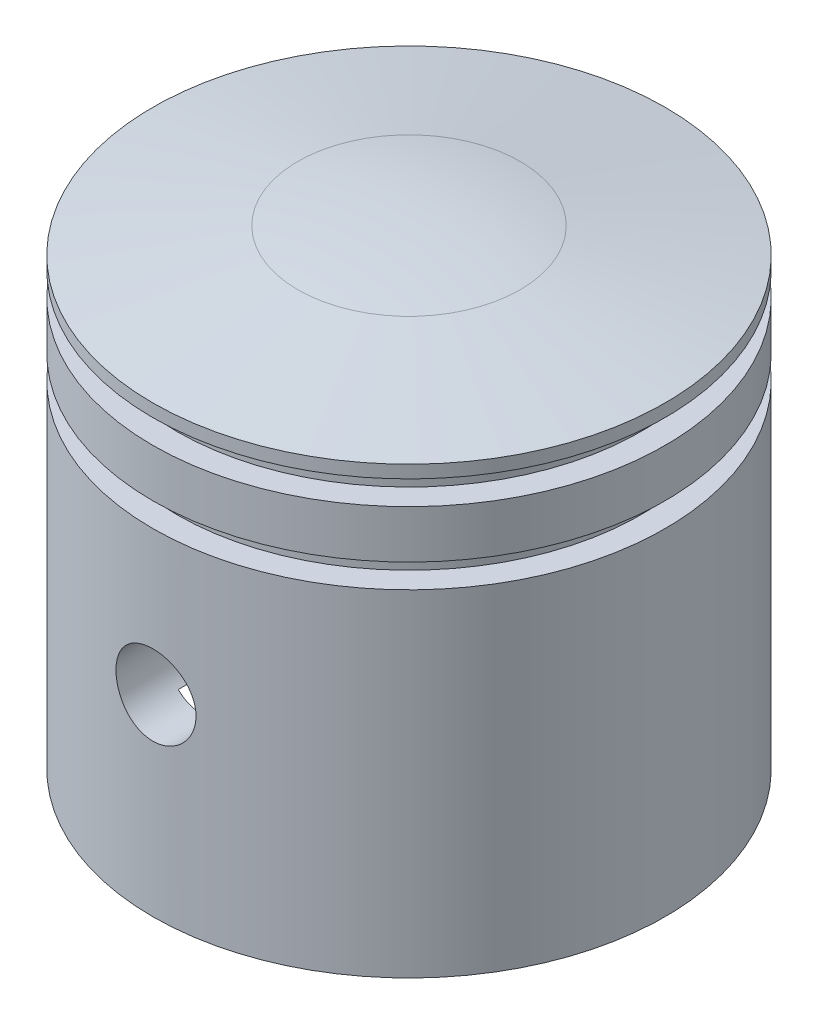
ISO-10303-21;
HEADER;
FILE_DESCRIPTION(('STEP AP214'),'2;1');
FILE_NAME('part.step','',(''),(''),'','','');
FILE_SCHEMA(('AUTOMOTIVE_DESIGN { 1 0 10303 214 1 1 1 1 }'));
ENDSEC;
DATA;
#1=APPLICATION_CONTEXT('core data for automotive mechanical design processes');
#2=APPLICATION_PROTOCOL_DEFINITION('international standard','automotive_design',2000,#1);
#3=PRODUCT_CONTEXT('',#1,'mechanical');
#4=PRODUCT('Part','Part','',(#3));
#5=PRODUCT_RELATED_PRODUCT_CATEGORY('part','',(#4));
#6=PRODUCT_DEFINITION_FORMATION('','',#4);
#7=PRODUCT_DEFINITION_CONTEXT('part definition',#1,'design');
#8=PRODUCT_DEFINITION('design','',#6,#7);
#9=PRODUCT_DEFINITION_SHAPE('','',#8);
#10=(LENGTH_UNIT() NAMED_UNIT(*) SI_UNIT(.MILLI.,.METRE.));
#11=(NAMED_UNIT(*) PLANE_ANGLE_UNIT() SI_UNIT($,.RADIAN.));
#12=(NAMED_UNIT(*) SI_UNIT($,.STERADIAN.) SOLID_ANGLE_UNIT());
#13=UNCERTAINTY_MEASURE_WITH_UNIT(LENGTH_MEASURE(1.E-05),#10,'distance_accuracy_value','');
#14=(GEOMETRIC_REPRESENTATION_CONTEXT(3) GLOBAL_UNCERTAINTY_ASSIGNED_CONTEXT((#13)) GLOBAL_UNIT_ASSIGNED_CONTEXT((#10,
#11,#12)) REPRESENTATION_CONTEXT('',''));
#15=CARTESIAN_POINT('',(0.,0.,0.));
#16=DIRECTION('',(0.,0.,1.));
#17=DIRECTION('',(1.,0.,0.));
#18=AXIS2_PLACEMENT_3D('',#15,#16,#17);
#19=CARTESIAN_POINT('',(0.,12.,-16.));
#20=DIRECTION('',(0.,0.,1.));
#21=DIRECTION('',(1.,0.,0.));
#22=AXIS2_PLACEMENT_3D('',#19,#20,#21);
#23=CYLINDRICAL_SURFACE('',#22,2.5);
#24=CARTESIAN_POINT('',(0.,14.5,-16.));
#25=CARTESIAN_POINT('',(-0.139515097271033,14.4999943017285,-15.9999977019448));
#26=CARTESIAN_POINT('',(-0.279109404865704,14.4882818862264,-15.9981561248574));
#27=CARTESIAN_POINT('',(-0.554391314978102,14.4417563087232,-15.9909869809759));
#28=CARTESIAN_POINT('',(-0.690075061323317,14.4069211074965,-15.9856560884472));
#29=CARTESIAN_POINT('',(-0.953512538047404,14.3152203371934,-15.9721069716578));
#30=CARTESIAN_POINT('',(-1.0812723522899,14.2583719186384,-15.9638909956317));
#31=CARTESIAN_POINT('',(-1.3254212510446,14.1243014548584,-15.9454779403815));
#32=CARTESIAN_POINT('',(-1.44181181036831,14.0470820569641,-15.9352811186255));
#33=CARTESIAN_POINT('',(-1.66091991165162,13.873766951646,-15.9139426841436));
#34=CARTESIAN_POINT('',(-1.76352747914264,13.7775330051098,-15.9027945139234));
#35=CARTESIAN_POINT('',(-1.95120768822823,13.5692180517311,-15.8808607613029));
#36=CARTESIAN_POINT('',(-2.03627928654192,13.4571361026998,-15.8700752005075));
#37=CARTESIAN_POINT('',(-2.18690544328884,13.2195617286563,-15.8500242812744));
#38=CARTESIAN_POINT('',(-2.25235273557992,13.0940005176382,-15.840767397861));
#39=CARTESIAN_POINT('',(-2.36118681597065,12.8334985891422,-15.8249120174236));
#40=CARTESIAN_POINT('',(-2.40457491010063,12.6985584274894,-15.8183133630222));
#41=CARTESIAN_POINT('',(-2.46771559322167,12.4242890988562,-15.8085863451104));
#42=CARTESIAN_POINT('',(-2.48765705487496,12.2850044141812,-15.8054302653236));
#43=CARTESIAN_POINT('',(-2.50392369757622,12.0050328111074,-15.8028617107177));
#44=CARTESIAN_POINT('',(-2.50025034860466,11.864345980534,-15.8034490028802));
#45=CARTESIAN_POINT('',(-2.4695458080889,11.5869029681473,-15.8082755045521));
#46=CARTESIAN_POINT('',(-2.44272562959693,11.4501227766469,-15.8124817218495));
#47=CARTESIAN_POINT('',(-2.36681937833752,11.1830279936407,-15.8240205634547));
#48=CARTESIAN_POINT('',(-2.31773262684132,11.0527135993595,-15.8313532830641));
#49=CARTESIAN_POINT('',(-2.19846916949384,10.8016112873228,-15.8483550685462));
#50=CARTESIAN_POINT('',(-2.12820372315549,10.6808662082269,-15.8580339308724));
#51=CARTESIAN_POINT('',(-1.96864058146637,10.4528004643145,-15.878630461501));
#52=CARTESIAN_POINT('',(-1.87934153253017,10.3454807551125,-15.8895482178821));
#53=CARTESIAN_POINT('',(-1.68309088822333,10.1460897533667,-15.911537862489));
#54=CARTESIAN_POINT('',(-1.57595800560539,10.0541968417305,-15.9226101363559));
#55=CARTESIAN_POINT('',(-1.34769694737936,9.8896668543601,-15.9435512534783));
#56=CARTESIAN_POINT('',(-1.22656870068132,9.81702987644317,-15.9534200906202));
#57=CARTESIAN_POINT('',(-0.973595927056491,9.69306192657761,-15.9708539902704));
#58=CARTESIAN_POINT('',(-0.841744186240459,9.641745441467,-15.9784174854193));
#59=CARTESIAN_POINT('',(-0.571149534696758,9.56203403255277,-15.9903756000068));
#60=CARTESIAN_POINT('',(-0.4324071306872,9.53363742593352,-15.9947704520898));
#61=CARTESIAN_POINT('',(-0.153508336763735,9.50081072354981,-15.9998651172728));
#62=CARTESIAN_POINT('',(-0.0133814615087024,9.49613552102382,-16.0006027179286));
#63=CARTESIAN_POINT('',(0.265654546411641,9.51023270533598,-15.9984028649127));
#64=CARTESIAN_POINT('',(0.404563719925156,9.52900430258911,-15.9954655349964));
#65=CARTESIAN_POINT('',(0.676473446265705,9.58925838768018,-15.9862692369322));
#66=CARTESIAN_POINT('',(0.809501262056041,9.63062075826773,-15.9800278421539));
#67=CARTESIAN_POINT('',(1.06673406785663,9.73475509439879,-15.9649207568356));
#68=CARTESIAN_POINT('',(1.19093861303941,9.79752813844267,-15.9560549341007));
#69=CARTESIAN_POINT('',(1.42807220225041,9.94327199112658,-15.9365897274094));
#70=CARTESIAN_POINT('',(1.54090512378372,10.0263974200905,-15.9259772866342));
#71=CARTESIAN_POINT('',(1.75110696507806,10.2102720859078,-15.9042388046444));
#72=CARTESIAN_POINT('',(1.84847490447018,10.3110224392049,-15.8931127309268));
#73=CARTESIAN_POINT('',(2.02588080776691,10.5283811972172,-15.8714802753665));
#74=CARTESIAN_POINT('',(2.10575398584126,10.6451248471223,-15.860980411908));
#75=CARTESIAN_POINT('',(2.2447556772664,10.8905160736613,-15.8419069280583));
#76=CARTESIAN_POINT('',(2.30388478778105,11.0191633074895,-15.83333325222));
#77=CARTESIAN_POINT('',(2.39946771944995,11.2842296407142,-15.8191307135236));
#78=CARTESIAN_POINT('',(2.43600654947912,11.4206174687656,-15.8134908234896));
#79=CARTESIAN_POINT('',(2.48564122040535,11.697689143664,-15.8057657028079));
#80=CARTESIAN_POINT('',(2.49873883084997,11.838372665419,-15.8036802038444));
#81=CARTESIAN_POINT('',(2.50107452690756,12.1183987159075,-15.8033105804488));
#82=CARTESIAN_POINT('',(2.49057180548425,12.2577390969335,-15.804985160429));
#83=CARTESIAN_POINT('',(2.44656223255901,12.5326452971443,-15.8118569894183));
#84=CARTESIAN_POINT('',(2.41305543086961,12.6682111245017,-15.8170542307995));
#85=CARTESIAN_POINT('',(2.32408329891852,12.9316378266405,-15.8303708885491));
#86=CARTESIAN_POINT('',(2.26863761738581,13.0595054782584,-15.8384876895341));
#87=CARTESIAN_POINT('',(2.13738768546417,13.3041656136763,-15.856731840474));
#88=CARTESIAN_POINT('',(2.06158262820886,13.4209576582884,-15.8668592701083));
#89=CARTESIAN_POINT('',(1.8908300813908,13.6414655441268,-15.8881156809226));
#90=CARTESIAN_POINT('',(1.79569107094768,13.7450321966138,-15.8992540116029));
#91=CARTESIAN_POINT('',(1.58937594638204,13.9348212363867,-15.9212004364073));
#92=CARTESIAN_POINT('',(1.47819612078432,14.0210395985919,-15.9320084534012));
#93=CARTESIAN_POINT('',(1.24216685884341,14.1741512230316,-15.952151024567));
#94=CARTESIAN_POINT('',(1.11723937214238,14.2409253727596,-15.9614763443027));
#95=CARTESIAN_POINT('',(0.857851882357782,14.3524409961929,-15.9775125983888));
#96=CARTESIAN_POINT('',(0.72340177658176,14.3972049725584,-15.9842262014212));
#97=CARTESIAN_POINT('',(0.490314239911593,14.4534330210906,-15.9927744586488));
#98=CARTESIAN_POINT('',(0.393105575651623,14.470868490629,-15.9954699162612));
#99=CARTESIAN_POINT('',(0.197277797850581,14.4941539133791,-15.9990834869762));
#100=CARTESIAN_POINT('',(0.0986587041691182,14.5000040295573,-16.0000016250796));
#101=CARTESIAN_POINT('',(0.,14.5,-16.));
#102=B_SPLINE_CURVE_WITH_KNOTS('',3,(#24,#25,#26,#27,#28,#29,#30,#31,#32,#33,#34,#35,#36,#37,
#38,#39,#40,#41,#42,#43,#44,#45,#46,#47,#48,#49,#50,#51,#52,#53,#54,#55,#56,#57,#58,#59,#60,#61,
#62,#63,#64,#65,#66,#67,#68,#69,#70,#71,#72,#73,#74,#75,#76,#77,#78,#79,#80,#81,#82,#83,#84,#85,
#86,#87,#88,#89,#90,#91,#92,#93,#94,#95,#96,#97,#98,#99,#100,#101),.UNSPECIFIED.,.T.,.F.,(4,2,2,
2,2,2,2,2,2,2,2,2,2,2,2,2,2,2,2,2,2,2,2,2,2,2,2,2,2,2,2,2,2,2,2,2,2,2,4),(0.,0.418184740477491,
0.836768642528014,1.25502707944103,1.6732311879203,2.09459568152199,2.51598523645422,
2.93963778605759,3.36326525009238,3.78345631134994,4.20362121670545,4.6199957602258,
5.0363829965105,5.45453977402347,5.87272629892068,6.29545732334367,6.71819049513827,
7.14121043754565,7.56419931829866,7.98280854005914,8.40140366528356,8.81779444756567,
9.23420620742031,9.65388541469671,10.0735912160142,10.4970948024959,10.9205861964898,
11.3424741039513,11.764330162293,12.1815758159869,12.598820566189,13.0156924696662,
13.4325808967135,13.8538201231554,14.275156971423,14.6990230419984,15.1224548565628,
15.4181801635154,15.7139013105871),.UNSPECIFIED.);
#103=CARTESIAN_POINT('',(0.,14.5,-16.));
#104=VERTEX_POINT('',#103);
#105=EDGE_CURVE('E150',#104,#104,#102,.T.);
#106=ORIENTED_EDGE('',*,*,#105,.F.);
#107=EDGE_LOOP('',(#106));
#108=FACE_BOUND('',#107,.T.);
#109=DIRECTION('',(0.,0.,1.));
#110=VECTOR('',#109,1.);
#111=CARTESIAN_POINT('',(1.5,10.,-16.));
#112=LINE('',#111,#110);
#113=CARTESIAN_POINT('',(1.5,10.,-9.88685996664259));
#114=VERTEX_POINT('',#113);
#115=CARTESIAN_POINT('',(1.5,10.,-12.913171570145));
#116=VERTEX_POINT('',#115);
#117=EDGE_CURVE('E86',#114,#116,#112,.F.);
#118=ORIENTED_EDGE('',*,*,#117,.F.);
#119=CARTESIAN_POINT('',(2.5,12.,-9.68245836551854));
#120=CARTESIAN_POINT('',(2.49999607859307,12.1380507509266,-9.6824610008786));
#121=CARTESIAN_POINT('',(2.48852624549765,12.2761448986785,-9.68544306014597));
#122=CARTESIAN_POINT('',(2.44302312546379,12.5483675781735,-9.69701861992564));
#123=CARTESIAN_POINT('',(2.40897670674211,12.6824937544682,-9.7056153862163));
#124=CARTESIAN_POINT('',(2.31949119963204,12.9428035381872,-9.7273872459615));
#125=CARTESIAN_POINT('',(2.26407972785449,13.0689971553857,-9.74055642690458));
#126=CARTESIAN_POINT('',(2.13352114126138,13.3103108525399,-9.76998192028759));
#127=CARTESIAN_POINT('',(2.05837318856069,13.4254304620802,-9.78623836378489));
#128=CARTESIAN_POINT('',(1.88870842731188,13.6438616452622,-9.82040716355625));
#129=CARTESIAN_POINT('',(1.79383688770405,13.74689360035,-9.83834597623034));
#130=CARTESIAN_POINT('',(1.58818206410066,13.9357613943603,-9.87362875515294));
#131=CARTESIAN_POINT('',(1.47739729418031,14.0215956256217,-9.89097266566388));
#132=CARTESIAN_POINT('',(1.24114520107896,14.1747754676313,-9.92340415520582));
#133=CARTESIAN_POINT('',(1.11549457619512,14.2418463881615,-9.93845687400592));
#134=CARTESIAN_POINT('',(0.854263184292763,14.3538096441531,-9.96430811925984));
#135=CARTESIAN_POINT('',(0.718683885791941,14.3987052519155,-9.97510727334345));
#136=CARTESIAN_POINT('',(0.444358758754162,14.4641478345786,-9.9910475884818));
#137=CARTESIAN_POINT('',(0.305732719548976,14.4851696443266,-9.99629893844314));
#138=CARTESIAN_POINT('',(0.0268288192627702,14.5037583792756,-10.000935941073));
#139=CARTESIAN_POINT('',(-0.113448794538067,14.5013287722096,-10.000322460967));
#140=CARTESIAN_POINT('',(-0.388380617930967,14.4734251497499,-9.99338094953534));
#141=CARTESIAN_POINT('',(-0.523090539002667,14.4484636749461,-9.98718002340871));
#142=CARTESIAN_POINT('',(-0.786345618534215,14.3770287299515,-9.96990836524857));
#143=CARTESIAN_POINT('',(-0.914890448426094,14.3305541146226,-9.95883737398452));
#144=CARTESIAN_POINT('',(-1.16351675875452,14.2169974293129,-9.93287509700884));
#145=CARTESIAN_POINT('',(-1.28351127441626,14.1497329553383,-9.91795019695011));
#146=CARTESIAN_POINT('',(-1.51068905585122,13.9966443208837,-9.88589903809692));
#147=CARTESIAN_POINT('',(-1.61787008771377,13.9108169314394,-9.8687723965265));
#148=CARTESIAN_POINT('',(-1.81943508771239,13.7202912580176,-9.83363713769356));
#149=CARTESIAN_POINT('',(-1.91339419768799,13.6151451076523,-9.81561719525297));
#150=CARTESIAN_POINT('',(-2.08244093990755,13.3904000264597,-9.78115043517327));
#151=CARTESIAN_POINT('',(-2.15752769011507,13.2708004205089,-9.76470369108289));
#152=CARTESIAN_POINT('',(-2.28697032255647,13.0197099658511,-9.73520496829319));
#153=CARTESIAN_POINT('',(-2.34122391742613,12.8881642696872,-9.72216983717007));
#154=CARTESIAN_POINT('',(-2.42671405159096,12.6174145319232,-9.70118640148669));
#155=CARTESIAN_POINT('',(-2.45795551638266,12.4782121360154,-9.69323700842733));
#156=CARTESIAN_POINT('',(-2.49582963866592,12.2000404984701,-9.68355356007457));
#157=CARTESIAN_POINT('',(-2.50309047391912,12.061162206659,-9.68166088976933));
#158=CARTESIAN_POINT('',(-2.49451699051516,11.7841780634147,-9.68387343364692));
#159=CARTESIAN_POINT('',(-2.4786847978498,11.6460721420506,-9.687978095703));
#160=CARTESIAN_POINT('',(-2.42492546393825,11.3768857350514,-9.70157081984979));
#161=CARTESIAN_POINT('',(-2.3873640682819,11.2457272734308,-9.71096970242532));
#162=CARTESIAN_POINT('',(-2.29161808167046,10.9915685421467,-9.73400718262805));
#163=CARTESIAN_POINT('',(-2.2334310477125,10.8685692409442,-9.74764628246408));
#164=CARTESIAN_POINT('',(-2.0967706679366,10.6315587221331,-9.77796137095511));
#165=CARTESIAN_POINT('',(-2.01792175383564,10.517771159957,-9.79469168607245));
#166=CARTESIAN_POINT('',(-1.84265073233613,10.3048116371985,-9.82917083071112));
#167=CARTESIAN_POINT('',(-1.7462257370136,10.2056420833499,-9.84691982728307));
#168=CARTESIAN_POINT('',(-1.53565680246182,10.0221889574291,-9.88197403031774));
#169=CARTESIAN_POINT('',(-1.42112988132898,9.9383399374512,-9.8992570206188));
#170=CARTESIAN_POINT('',(-1.17925670673669,9.79106413304875,-9.93097216613689));
#171=CARTESIAN_POINT('',(-1.05191112239398,9.72763628339179,-9.94540447003949));
#172=CARTESIAN_POINT('',(-0.788895504327727,9.62355396547207,-9.96970115738325));
#173=CARTESIAN_POINT('',(-0.653293452569706,9.58273571562093,-9.97959830022409));
#174=CARTESIAN_POINT('',(-0.376874400797019,9.52453966539158,-9.99385293395789));
#175=CARTESIAN_POINT('',(-0.236058412603103,9.50715734126096,-9.99821149393422));
#176=CARTESIAN_POINT('',(0.0427088161083069,9.49658102606115,-10.0008542352202));
#177=CARTESIAN_POINT('',(0.180634567415054,9.50274572726148,-9.99929947199971));
#178=CARTESIAN_POINT('',(0.453418741036876,9.53761956823587,-9.99064741143608));
#179=CARTESIAN_POINT('',(0.588277254452321,9.56632803753292,-9.98355027892922));
#180=CARTESIAN_POINT('',(0.850427589111934,9.64513054942715,-9.96463582134723));
#181=CARTESIAN_POINT('',(0.977756236452156,9.69510863328595,-9.95284411255981));
#182=CARTESIAN_POINT('',(1.22229263260406,9.81492644754893,-9.92578222284145));
#183=CARTESIAN_POINT('',(1.33949910316408,9.88476868167621,-9.91051160346894));
#184=CARTESIAN_POINT('',(1.56350482105826,10.0442880849903,-9.87768124200718));
#185=CARTESIAN_POINT('',(1.66998747074584,10.1344003572596,-9.86007542354161));
#186=CARTESIAN_POINT('',(1.86653755068376,10.3310571299434,-9.82476622642974));
#187=CARTESIAN_POINT('',(1.95660081269148,10.4376057902779,-9.80706282418256));
#188=CARTESIAN_POINT('',(2.11940506617958,10.6665035354736,-9.77318689613756));
#189=CARTESIAN_POINT('',(2.19179154854095,10.7891103084131,-9.75704909183222));
#190=CARTESIAN_POINT('',(2.31481724146367,11.045138724687,-9.7285988873707));
#191=CARTESIAN_POINT('',(2.36547227438038,11.1785524152346,-9.71628370583034));
#192=CARTESIAN_POINT('',(2.43605632142751,11.4264425295879,-9.69879771876843));
#193=CARTESIAN_POINT('',(2.4599829264922,11.5397329109653,-9.69271657508747));
#194=CARTESIAN_POINT('',(2.49195573142942,11.7686721724942,-9.6845459645655));
#195=CARTESIAN_POINT('',(2.50000328592938,11.884320850611,-9.68245615722769));
#196=CARTESIAN_POINT('',(2.5,12.,-9.68245836551854));
#197=B_SPLINE_CURVE_WITH_KNOTS('',3,(#119,#120,#121,#122,#123,#124,#125,#126,#127,#128,#129,
#130,#131,#132,#133,#134,#135,#136,#137,#138,#139,#140,#141,#142,#143,#144,#145,#146,#147,#148,
#149,#150,#151,#152,#153,#154,#155,#156,#157,#158,#159,#160,#161,#162,#163,#164,#165,#166,#167,
#168,#169,#170,#171,#172,#173,#174,#175,#176,#177,#178,#179,#180,#181,#182,#183,#184,#185,#186,
#187,#188,#189,#190,#191,#192,#193,#194,#195,#196),.UNSPECIFIED.,.T.,.F.,(4,2,2,2,2,2,2,2,2,2,2,
2,2,2,2,2,2,2,2,2,2,2,2,2,2,2,2,2,2,2,2,2,2,2,2,2,2,2,4),(0.,0.413727441736135,
0.827695741428666,1.24113072716602,1.65458326755479,2.07623954192976,2.49793521479867,
2.9255149639792,3.35303159847092,3.77188750995347,4.1906814866602,4.60018262688947,
5.00970556724786,5.42292874254445,5.83622385468913,6.26070466571912,6.68520531199802,
7.11176432008403,7.53823200129548,7.95343574764205,8.36860127188747,8.77697405014152,
9.18539521426363,9.60182845864103,10.0183301888999,10.4452533097026,10.872154157245,
11.2959207281187,11.7196054891398,12.131834461324,12.5440511738193,12.9540487656466,
13.3640980574302,13.7839709658702,14.2039503157045,14.6317647729113,15.0592672137502,
15.4059782718573,15.7526597510792),.UNSPECIFIED.);
#198=CARTESIAN_POINT('',(-1.5,10.,-9.88685996664259));
#199=VERTEX_POINT('',#198);
#200=EDGE_CURVE('E145',#114,#199,#197,.T.);
#201=ORIENTED_EDGE('',*,*,#200,.T.);
#202=DIRECTION('',(0.,0.,1.));
#203=VECTOR('',#202,1.);
#204=CARTESIAN_POINT('',(-1.5,10.,-16.));
#205=LINE('',#204,#203);
#206=CARTESIAN_POINT('',(-1.5,10.,-12.913171570145));
#207=VERTEX_POINT('',#206);
#208=EDGE_CURVE('E105',#207,#199,#205,.T.);
#209=ORIENTED_EDGE('',*,*,#208,.F.);
#210=CARTESIAN_POINT('',(-1.5,10.,-12.913171570145));
#211=CARTESIAN_POINT('',(-1.44426579878659,9.95820085358915,-12.9196464939997));
#212=CARTESIAN_POINT('',(-1.38679796540747,9.91874092086907,-12.9259549192278));
#213=CARTESIAN_POINT('',(-1.26873073828123,9.84473133764257,-12.9380773902685));
#214=CARTESIAN_POINT('',(-1.20813121991303,9.81018188274731,-12.9438914163828));
#215=CARTESIAN_POINT('',(-1.02224257355282,9.71430178140072,-12.9603404608392));
#216=CARTESIAN_POINT('',(-0.892775127826518,9.66067330241013,-12.9699930765876));
#217=CARTESIAN_POINT('',(-0.626442746105629,9.57571702553779,-12.9855839172602));
#218=CARTESIAN_POINT('',(-0.489571482352221,9.54440863841842,-12.9915189085937));
#219=CARTESIAN_POINT('',(-0.212467802603065,9.50512260914373,-12.9990013032835));
#220=CARTESIAN_POINT('',(-0.0722376211678123,9.49712986799228,-13.0005515461425));
#221=CARTESIAN_POINT('',(0.206029683769606,9.50466026890764,-12.9991042541622));
#222=CARTESIAN_POINT('',(0.344074092382288,9.51992916830979,-12.996155887224));
#223=CARTESIAN_POINT('',(0.615650842540818,9.57304239783094,-12.986125153176));
#224=CARTESIAN_POINT('',(0.749181403888349,9.61089552758196,-12.9790411747057));
#225=CARTESIAN_POINT('',(0.989738928879762,9.70119099514041,-12.9627490398878));
#226=CARTESIAN_POINT('',(1.09785208331175,9.75083257474323,-12.9539797808047));
#227=CARTESIAN_POINT('',(1.25371177293855,9.83627154609569,-12.9395107443663));
#228=CARTESIAN_POINT('',(1.30459866498264,9.86656964555138,-12.9344702910731));
#229=CARTESIAN_POINT('',(1.4040757561164,9.9306832908871,-12.9240502172861));
#230=CARTESIAN_POINT('',(1.45266577202019,9.96449911663509,-12.9186705698196));
#231=CARTESIAN_POINT('',(1.5,10.,-12.913171570145));
#232=B_SPLINE_CURVE_WITH_KNOTS('',3,(#210,#211,#212,#213,#214,#215,#216,#217,#218,#219,#220,
#221,#222,#223,#224,#225,#226,#227,#228,#229,#230,#231),.UNSPECIFIED.,.F.,.F.,(4,2,2,2,2,2,2,2,
2,2,4),(0.,0.209776062140149,0.419560478466375,0.838801230764256,1.25840613426738,
1.67773924513587,2.09252194041192,2.50746635565219,2.86404950501363,3.04223164009906,
3.22042796209395),.UNSPECIFIED.);
#233=EDGE_CURVE('E100',#207,#116,#232,.T.);
#234=ORIENTED_EDGE('',*,*,#233,.T.);
#235=EDGE_LOOP('',(#118,#201,#209,#234));
#236=FACE_BOUND('',#235,.T.);
#237=ADVANCED_FACE('F41',(#108,#236),#23,.F.);
#238=CARTESIAN_POINT('',(0.,9.5,16.));
#239=CARTESIAN_POINT('',(-0.139515097271033,9.50000569827152,15.9999977019448));
#240=CARTESIAN_POINT('',(-0.279109404865704,9.51171811377356,15.9981561248574));
#241=CARTESIAN_POINT('',(-0.554391314978102,9.55824369127675,15.9909869809759));
#242=CARTESIAN_POINT('',(-0.690075061323317,9.59307889250351,15.9856560884472));
#243=CARTESIAN_POINT('',(-0.953512538047404,9.68477966280662,15.9721069716578));
#244=CARTESIAN_POINT('',(-1.0812723522899,9.7416280813616,15.9638909956317));
#245=CARTESIAN_POINT('',(-1.3254212510446,9.87569854514161,15.9454779403815));
#246=CARTESIAN_POINT('',(-1.44181181036831,9.95291794303594,15.9352811186255));
#247=CARTESIAN_POINT('',(-1.66091991165162,10.126233048354,15.9139426841436));
#248=CARTESIAN_POINT('',(-1.76352747914264,10.2224669948902,15.9027945139234));
#249=CARTESIAN_POINT('',(-1.95120768822823,10.4307819482689,15.8808607613029));
#250=CARTESIAN_POINT('',(-2.03627928654192,10.5428638973002,15.8700752005075));
#251=CARTESIAN_POINT('',(-2.18690544328884,10.7804382713437,15.8500242812744));
#252=CARTESIAN_POINT('',(-2.25235273557992,10.9059994823618,15.840767397861));
#253=CARTESIAN_POINT('',(-2.36118681597065,11.1665014108578,15.8249120174236));
#254=CARTESIAN_POINT('',(-2.40457491010063,11.3014415725106,15.8183133630222));
#255=CARTESIAN_POINT('',(-2.46771559322167,11.5757109011438,15.8085863451104));
#256=CARTESIAN_POINT('',(-2.48765705487496,11.7149955858188,15.8054302653236));
#257=CARTESIAN_POINT('',(-2.50392369757622,11.9949671888926,15.8028617107177));
#258=CARTESIAN_POINT('',(-2.50025034860466,12.135654019466,15.8034490028802));
#259=CARTESIAN_POINT('',(-2.4695458080889,12.4130970318527,15.8082755045521));
#260=CARTESIAN_POINT('',(-2.44272562959693,12.5498772233531,15.8124817218495));
#261=CARTESIAN_POINT('',(-2.36681937833752,12.8169720063593,15.8240205634547));
#262=CARTESIAN_POINT('',(-2.31773262684132,12.9472864006405,15.8313532830641));
#263=CARTESIAN_POINT('',(-2.19846916949384,13.1983887126772,15.8483550685462));
#264=CARTESIAN_POINT('',(-2.12820372315549,13.3191337917731,15.8580339308724));
#265=CARTESIAN_POINT('',(-1.96864058146637,13.5471995356855,15.878630461501));
#266=CARTESIAN_POINT('',(-1.87934153253017,13.6545192448875,15.8895482178821));
#267=CARTESIAN_POINT('',(-1.68309088822333,13.8539102466333,15.911537862489));
#268=CARTESIAN_POINT('',(-1.57595800560539,13.9458031582695,15.9226101363559));
#269=CARTESIAN_POINT('',(-1.34769694737936,14.1103331456399,15.9435512534783));
#270=CARTESIAN_POINT('',(-1.22656870068132,14.1829701235568,15.9534200906202));
#271=CARTESIAN_POINT('',(-0.97359592705649,14.3069380734224,15.9708539902704));
#272=CARTESIAN_POINT('',(-0.841744186240459,14.358254558533,15.9784174854193));
#273=CARTESIAN_POINT('',(-0.571149534696759,14.4379659674472,15.9903756000068));
#274=CARTESIAN_POINT('',(-0.4324071306872,14.4663625740665,15.9947704520898));
#275=CARTESIAN_POINT('',(-0.153508336763735,14.4991892764502,15.9998651172728));
#276=CARTESIAN_POINT('',(-0.0133814615087023,14.5038644789762,16.0006027179286));
#277=CARTESIAN_POINT('',(0.265654546411641,14.489767294664,15.9984028649127));
#278=CARTESIAN_POINT('',(0.404563719925156,14.4709956974109,15.9954655349964));
#279=CARTESIAN_POINT('',(0.676473446265705,14.4107416123198,15.9862692369322));
#280=CARTESIAN_POINT('',(0.809501262056042,14.3693792417323,15.9800278421539));
#281=CARTESIAN_POINT('',(1.06673406785663,14.2652449056012,15.9649207568356));
#282=CARTESIAN_POINT('',(1.19093861303941,14.2024718615573,15.9560549341007));
#283=CARTESIAN_POINT('',(1.42807220225041,14.0567280088734,15.9365897274094));
#284=CARTESIAN_POINT('',(1.54090512378372,13.9736025799095,15.9259772866342));
#285=CARTESIAN_POINT('',(1.75110696507806,13.7897279140922,15.9042388046444));
#286=CARTESIAN_POINT('',(1.84847490447018,13.6889775607952,15.8931127309268));
#287=CARTESIAN_POINT('',(2.02588080776691,13.4716188027828,15.8714802753665));
#288=CARTESIAN_POINT('',(2.10575398584126,13.3548751528777,15.860980411908));
#289=CARTESIAN_POINT('',(2.2447556772664,13.1094839263387,15.8419069280583));
#290=CARTESIAN_POINT('',(2.30388478778105,12.9808366925105,15.83333325222));
#291=CARTESIAN_POINT('',(2.39946771944995,12.7157703592858,15.8191307135236));
#292=CARTESIAN_POINT('',(2.43600654947912,12.5793825312344,15.8134908234896));
#293=CARTESIAN_POINT('',(2.48564122040535,12.302310856336,15.8057657028079));
#294=CARTESIAN_POINT('',(2.49873883084997,12.161627334581,15.8036802038444));
#295=CARTESIAN_POINT('',(2.50107452690756,11.8816012840925,15.8033105804488));
#296=CARTESIAN_POINT('',(2.49057180548425,11.7422609030665,15.804985160429));
#297=CARTESIAN_POINT('',(2.44656223255901,11.4673547028557,15.8118569894183));
#298=CARTESIAN_POINT('',(2.41305543086961,11.3317888754983,15.8170542307995));
#299=CARTESIAN_POINT('',(2.32408329891852,11.0683621733595,15.8303708885491));
#300=CARTESIAN_POINT('',(2.26863761738581,10.9404945217416,15.8384876895341));
#301=CARTESIAN_POINT('',(2.13738768546417,10.6958343863237,15.856731840474));
#302=CARTESIAN_POINT('',(2.06158262820886,10.5790423417116,15.8668592701083));
#303=CARTESIAN_POINT('',(1.8908300813908,10.3585344558732,15.8881156809226));
#304=CARTESIAN_POINT('',(1.79569107094768,10.2549678033862,15.8992540116029));
#305=CARTESIAN_POINT('',(1.58937594638204,10.0651787636133,15.9212004364073));
#306=CARTESIAN_POINT('',(1.47819612078432,9.97896040140812,15.9320084534012));
#307=CARTESIAN_POINT('',(1.24216685884341,9.82584877696844,15.952151024567));
#308=CARTESIAN_POINT('',(1.11723937214238,9.75907462724039,15.9614763443027));
#309=CARTESIAN_POINT('',(0.857851882357782,9.64755900380705,15.9775125983888));
#310=CARTESIAN_POINT('',(0.72340177658176,9.60279502744161,15.9842262014212));
#311=CARTESIAN_POINT('',(0.490314239911593,9.54656697890941,15.9927744586488));
#312=CARTESIAN_POINT('',(0.393105575651623,9.529131509371,15.9954699162612));
#313=CARTESIAN_POINT('',(0.197277797850581,9.50584608662092,15.9990834869762));
#314=CARTESIAN_POINT('',(0.0986587041691182,9.49999597044266,16.0000016250796));
#315=CARTESIAN_POINT('',(0.,9.5,16.));
#316=B_SPLINE_CURVE_WITH_KNOTS('',3,(#238,#239,#240,#241,#242,#243,#244,#245,#246,#247,#248,
#249,#250,#251,#252,#253,#254,#255,#256,#257,#258,#259,#260,#261,#262,#263,#264,#265,#266,#267,
#268,#269,#270,#271,#272,#273,#274,#275,#276,#277,#278,#279,#280,#281,#282,#283,#284,#285,#286,
#287,#288,#289,#290,#291,#292,#293,#294,#295,#296,#297,#298,#299,#300,#301,#302,#303,#304,#305,
#306,#307,#308,#309,#310,#311,#312,#313,#314,#315),.UNSPECIFIED.,.T.,.F.,(4,2,2,2,2,2,2,2,2,2,2,
2,2,2,2,2,2,2,2,2,2,2,2,2,2,2,2,2,2,2,2,2,2,2,2,2,2,2,4),(0.,0.418184740477491,
0.836768642528014,1.25502707944103,1.6732311879203,2.09459568152199,2.51598523645422,
2.93963778605759,3.36326525009238,3.78345631134994,4.20362121670545,4.6199957602258,
5.0363829965105,5.45453977402347,5.87272629892068,6.29545732334367,6.71819049513827,
7.14121043754565,7.56419931829866,7.98280854005914,8.40140366528356,8.81779444756567,
9.23420620742031,9.65388541469671,10.0735912160142,10.4970948024959,10.9205861964898,
11.3424741039513,11.764330162293,12.1815758159869,12.598820566189,13.0156924696662,
13.4325808967135,13.8538201231554,14.275156971423,14.6990230419984,15.1224548565628,
15.4181801635154,15.7139013105871),.UNSPECIFIED.);
#317=CARTESIAN_POINT('',(0.,9.5,16.));
#318=VERTEX_POINT('',#317);
#319=EDGE_CURVE('E152',#318,#318,#316,.T.);
#320=ORIENTED_EDGE('',*,*,#319,.F.);
#321=EDGE_LOOP('',(#320));
#322=FACE_BOUND('',#321,.T.);
#323=DIRECTION('',(0.,0.,1.));
#324=VECTOR('',#323,1.);
#325=CARTESIAN_POINT('',(1.5,10.,-16.));
#326=LINE('',#325,#324);
#327=CARTESIAN_POINT('',(1.5,10.,12.913171570145));
#328=VERTEX_POINT('',#327);
#329=CARTESIAN_POINT('',(1.50000000000005,9.99999999999991,9.8868599666426));
#330=VERTEX_POINT('',#329);
#331=EDGE_CURVE('E62',#328,#330,#326,.F.);
#332=ORIENTED_EDGE('',*,*,#331,.F.);
#333=CARTESIAN_POINT('',(1.5,10.,12.913171570145));
#334=CARTESIAN_POINT('',(1.44426579878659,9.95820085358915,12.9196464939997));
#335=CARTESIAN_POINT('',(1.38679796540747,9.91874092086907,12.9259549192278));
#336=CARTESIAN_POINT('',(1.26873073828123,9.84473133764257,12.9380773902685));
#337=CARTESIAN_POINT('',(1.20813121991303,9.81018188274731,12.9438914163828));
#338=CARTESIAN_POINT('',(1.02224257355282,9.71430178140072,12.9603404608392));
#339=CARTESIAN_POINT('',(0.892775127826518,9.66067330241013,12.9699930765876));
#340=CARTESIAN_POINT('',(0.626442746105629,9.57571702553779,12.9855839172602));
#341=CARTESIAN_POINT('',(0.489571482352221,9.54440863841842,12.9915189085937));
#342=CARTESIAN_POINT('',(0.212467802603065,9.50512260914373,12.9990013032835));
#343=CARTESIAN_POINT('',(0.0722376211678123,9.49712986799228,13.0005515461425));
#344=CARTESIAN_POINT('',(-0.206029683769606,9.50466026890764,12.9991042541622));
#345=CARTESIAN_POINT('',(-0.344074092382288,9.51992916830979,12.996155887224));
#346=CARTESIAN_POINT('',(-0.615650842540818,9.57304239783094,12.986125153176));
#347=CARTESIAN_POINT('',(-0.749181403888349,9.61089552758196,12.9790411747057));
#348=CARTESIAN_POINT('',(-0.989738928879762,9.70119099514041,12.9627490398878));
#349=CARTESIAN_POINT('',(-1.09785208331175,9.75083257474323,12.9539797808047));
#350=CARTESIAN_POINT('',(-1.25371177293855,9.83627154609569,12.9395107443663));
#351=CARTESIAN_POINT('',(-1.30459866498264,9.86656964555138,12.9344702910731));
#352=CARTESIAN_POINT('',(-1.4040757561164,9.9306832908871,12.9240502172861));
#353=CARTESIAN_POINT('',(-1.45266577202019,9.96449911663509,12.9186705698196));
#354=CARTESIAN_POINT('',(-1.5,10.,12.913171570145));
#355=B_SPLINE_CURVE_WITH_KNOTS('',3,(#333,#334,#335,#336,#337,#338,#339,#340,#341,#342,#343,
#344,#345,#346,#347,#348,#349,#350,#351,#352,#353,#354),.UNSPECIFIED.,.F.,.F.,(4,2,2,2,2,2,2,2,
2,2,4),(0.,0.209776062140149,0.419560478466375,0.838801230764256,1.25840613426738,
1.67773924513587,2.09252194041192,2.50746635565219,2.86404950501363,3.04223164009906,
3.22042796209395),.UNSPECIFIED.);
#356=CARTESIAN_POINT('',(-1.5,10.,12.913171570145));
#357=VERTEX_POINT('',#356);
#358=EDGE_CURVE('E11',#328,#357,#355,.T.);
#359=ORIENTED_EDGE('',*,*,#358,.T.);
#360=DIRECTION('',(0.,0.,1.));
#361=VECTOR('',#360,1.);
#362=CARTESIAN_POINT('',(-1.5,10.,-16.));
#363=LINE('',#362,#361);
#364=CARTESIAN_POINT('',(-1.5,10.,9.88685996664259));
#365=VERTEX_POINT('',#364);
#366=EDGE_CURVE('E95',#365,#357,#363,.T.);
#367=ORIENTED_EDGE('',*,*,#366,.F.);
#368=CARTESIAN_POINT('',(2.5,12.,9.68245836551854));
#369=CARTESIAN_POINT('',(2.49999607859307,11.8619492490734,9.6824610008786));
#370=CARTESIAN_POINT('',(2.48852624549765,11.7238551013215,9.68544306014597));
#371=CARTESIAN_POINT('',(2.44302312546379,11.4516324218265,9.69701861992564));
#372=CARTESIAN_POINT('',(2.40897670674211,11.3175062455318,9.7056153862163));
#373=CARTESIAN_POINT('',(2.31949119963204,11.0571964618128,9.7273872459615));
#374=CARTESIAN_POINT('',(2.26407972785449,10.9310028446143,9.74055642690458));
#375=CARTESIAN_POINT('',(2.13352114126138,10.6896891474601,9.76998192028759));
#376=CARTESIAN_POINT('',(2.05837318856069,10.5745695379198,9.78623836378489));
#377=CARTESIAN_POINT('',(1.88870842731188,10.3561383547378,9.82040716355625));
#378=CARTESIAN_POINT('',(1.79383688770405,10.25310639965,9.83834597623034));
#379=CARTESIAN_POINT('',(1.58818206410066,10.0642386056397,9.87362875515294));
#380=CARTESIAN_POINT('',(1.47739729418031,9.97840437437825,9.89097266566388));
#381=CARTESIAN_POINT('',(1.24114520107896,9.82522453236872,9.92340415520582));
#382=CARTESIAN_POINT('',(1.11549457619512,9.75815361183853,9.93845687400592));
#383=CARTESIAN_POINT('',(0.854263184292763,9.64619035584692,9.96430811925984));
#384=CARTESIAN_POINT('',(0.718683885791941,9.60129474808449,9.97510727334345));
#385=CARTESIAN_POINT('',(0.444358758754162,9.53585216542142,9.9910475884818));
#386=CARTESIAN_POINT('',(0.305732719548976,9.51483035567342,9.99629893844314));
#387=CARTESIAN_POINT('',(0.0268288192627702,9.49624162072445,10.000935941073));
#388=CARTESIAN_POINT('',(-0.113448794538067,9.4986712277904,10.000322460967));
#389=CARTESIAN_POINT('',(-0.388380617930967,9.52657485025014,9.99338094953534));
#390=CARTESIAN_POINT('',(-0.523090539002667,9.55153632505385,9.98718002340871));
#391=CARTESIAN_POINT('',(-0.786345618534215,9.6229712700485,9.96990836524857));
#392=CARTESIAN_POINT('',(-0.914890448426094,9.66944588537741,9.95883737398452));
#393=CARTESIAN_POINT('',(-1.16351675875452,9.78300257068706,9.93287509700884));
#394=CARTESIAN_POINT('',(-1.28351127441626,9.85026704466174,9.91795019695011));
#395=CARTESIAN_POINT('',(-1.51068905585122,10.0033556791163,9.88589903809692));
#396=CARTESIAN_POINT('',(-1.61787008771377,10.0891830685606,9.8687723965265));
#397=CARTESIAN_POINT('',(-1.81943508771239,10.2797087419824,9.83363713769356));
#398=CARTESIAN_POINT('',(-1.91339419768799,10.3848548923477,9.81561719525297));
#399=CARTESIAN_POINT('',(-2.08244093990755,10.6095999735403,9.78115043517327));
#400=CARTESIAN_POINT('',(-2.15752769011507,10.7291995794911,9.76470369108289));
#401=CARTESIAN_POINT('',(-2.28697032255647,10.9802900341489,9.73520496829319));
#402=CARTESIAN_POINT('',(-2.34122391742613,11.1118357303128,9.72216983717007));
#403=CARTESIAN_POINT('',(-2.42671405159096,11.3825854680768,9.70118640148669));
#404=CARTESIAN_POINT('',(-2.45795551638266,11.5217878639846,9.69323700842733));
#405=CARTESIAN_POINT('',(-2.49582963866592,11.7999595015299,9.68355356007457));
#406=CARTESIAN_POINT('',(-2.50309047391912,11.938837793341,9.68166088976933));
#407=CARTESIAN_POINT('',(-2.49451699051516,12.2158219365853,9.68387343364692));
#408=CARTESIAN_POINT('',(-2.4786847978498,12.3539278579494,9.687978095703));
#409=CARTESIAN_POINT('',(-2.42492546393825,12.6231142649486,9.70157081984979));
#410=CARTESIAN_POINT('',(-2.3873640682819,12.7542727265692,9.71096970242531));
#411=CARTESIAN_POINT('',(-2.29161808167046,13.0084314578533,9.73400718262805));
#412=CARTESIAN_POINT('',(-2.2334310477125,13.1314307590558,9.74764628246408));
#413=CARTESIAN_POINT('',(-2.0967706679366,13.3684412778669,9.77796137095511));
#414=CARTESIAN_POINT('',(-2.01792175383564,13.482228840043,9.79469168607245));
#415=CARTESIAN_POINT('',(-1.84265073233613,13.6951883628015,9.82917083071112));
#416=CARTESIAN_POINT('',(-1.7462257370136,13.7943579166501,9.84691982728307));
#417=CARTESIAN_POINT('',(-1.53565680246182,13.9778110425709,9.88197403031774));
#418=CARTESIAN_POINT('',(-1.42112988132898,14.0616600625488,9.8992570206188));
#419=CARTESIAN_POINT('',(-1.17925670673669,14.2089358669513,9.93097216613689));
#420=CARTESIAN_POINT('',(-1.05191112239398,14.2723637166082,9.94540447003949));
#421=CARTESIAN_POINT('',(-0.788895504327728,14.3764460345279,9.96970115738325));
#422=CARTESIAN_POINT('',(-0.653293452569707,14.4172642843791,9.97959830022409));
#423=CARTESIAN_POINT('',(-0.376874400797019,14.4754603346084,9.99385293395789));
#424=CARTESIAN_POINT('',(-0.236058412603103,14.492842658739,9.99821149393422));
#425=CARTESIAN_POINT('',(0.0427088161083068,14.5034189739388,10.0008542352202));
#426=CARTESIAN_POINT('',(0.180634567415054,14.4972542727385,9.99929947199971));
#427=CARTESIAN_POINT('',(0.453418741036877,14.4623804317641,9.99064741143608));
#428=CARTESIAN_POINT('',(0.588277254452321,14.4336719624671,9.98355027892922));
#429=CARTESIAN_POINT('',(0.850427589111934,14.3548694505728,9.96463582134723));
#430=CARTESIAN_POINT('',(0.977756236452156,14.3048913667141,9.95284411255981));
#431=CARTESIAN_POINT('',(1.22229263260406,14.1850735524511,9.92578222284145));
#432=CARTESIAN_POINT('',(1.33949910316408,14.1152313183238,9.91051160346894));
#433=CARTESIAN_POINT('',(1.56350482105826,13.9557119150097,9.87768124200718));
#434=CARTESIAN_POINT('',(1.66998747074584,13.8655996427404,9.86007542354161));
#435=CARTESIAN_POINT('',(1.86653755068376,13.6689428700566,9.82476622642974));
#436=CARTESIAN_POINT('',(1.95660081269148,13.5623942097221,9.80706282418256));
#437=CARTESIAN_POINT('',(2.11940506617958,13.3334964645264,9.77318689613756));
#438=CARTESIAN_POINT('',(2.19179154854095,13.2108896915869,9.75704909183222));
#439=CARTESIAN_POINT('',(2.31481724146367,12.954861275313,9.7285988873707));
#440=CARTESIAN_POINT('',(2.36547227438038,12.8214475847654,9.71628370583034));
#441=CARTESIAN_POINT('',(2.43605632142751,12.5735574704121,9.69879771876843));
#442=CARTESIAN_POINT('',(2.4599829264922,12.4602670890347,9.69271657508747));
#443=CARTESIAN_POINT('',(2.49195573142942,12.2313278275058,9.6845459645655));
#444=CARTESIAN_POINT('',(2.50000328592938,12.115679149389,9.68245615722769));
#445=CARTESIAN_POINT('',(2.5,12.,9.68245836551854));
#446=B_SPLINE_CURVE_WITH_KNOTS('',3,(#368,#369,#370,#371,#372,#373,#374,#375,#376,#377,#378,
#379,#380,#381,#382,#383,#384,#385,#386,#387,#388,#389,#390,#391,#392,#393,#394,#395,#396,#397,
#398,#399,#400,#401,#402,#403,#404,#405,#406,#407,#408,#409,#410,#411,#412,#413,#414,#415,#416,
#417,#418,#419,#420,#421,#422,#423,#424,#425,#426,#427,#428,#429,#430,#431,#432,#433,#434,#435,
#436,#437,#438,#439,#440,#441,#442,#443,#444,#445),.UNSPECIFIED.,.T.,.F.,(4,2,2,2,2,2,2,2,2,2,2,
2,2,2,2,2,2,2,2,2,2,2,2,2,2,2,2,2,2,2,2,2,2,2,2,2,2,2,4),(0.,0.413727441736135,
0.827695741428666,1.24113072716602,1.65458326755479,2.07623954192976,2.49793521479867,
2.9255149639792,3.35303159847092,3.77188750995347,4.19068148666021,4.60018262688947,
5.00970556724786,5.42292874254445,5.83622385468913,6.26070466571912,6.68520531199802,
7.11176432008403,7.53823200129548,7.95343574764204,8.36860127188747,8.77697405014152,
9.18539521426363,9.60182845864103,10.0183301888999,10.4452533097026,10.872154157245,
11.2959207281187,11.7196054891398,12.131834461324,12.5440511738193,12.9540487656466,
13.3640980574302,13.7839709658702,14.2039503157045,14.6317647729113,15.0592672137502,
15.4059782718573,15.7526597510792),.UNSPECIFIED.);
#447=EDGE_CURVE('E109',#365,#330,#446,.T.);
#448=ORIENTED_EDGE('',*,*,#447,.T.);
#449=EDGE_LOOP('',(#332,#359,#367,#448));
#450=FACE_BOUND('',#449,.T.);
#451=ADVANCED_FACE('F136',(#322,#450),#23,.F.);
#452=CARTESIAN_POINT('',(0.,24.,0.));
#453=DIRECTION('',(0.,-1.,0.));
#454=DIRECTION('',(0.,0.,-1.));
#455=AXIS2_PLACEMENT_3D('',#452,#453,#454);
#456=CYLINDRICAL_SURFACE('',#455,10.);
#457=CARTESIAN_POINT('',(0.,24.,0.));
#458=DIRECTION('',(0.,-1.,0.));
#459=DIRECTION('',(0.,0.,-1.));
#460=AXIS2_PLACEMENT_3D('',#457,#458,#459);
#461=CIRCLE('',#460,10.);
#462=CARTESIAN_POINT('',(0.,24.,-10.));
#463=VERTEX_POINT('',#462);
#464=EDGE_CURVE('E106',#463,#463,#461,.T.);
#465=ORIENTED_EDGE('',*,*,#464,.F.);
#466=EDGE_LOOP('',(#465));
#467=FACE_BOUND('',#466,.T.);
#468=CARTESIAN_POINT('',(0.,10.,0.));
#469=DIRECTION('',(0.,-1.,0.));
#470=DIRECTION('',(0.,0.,-1.));
#471=AXIS2_PLACEMENT_3D('',#468,#469,#470);
#472=CIRCLE('',#471,10.);
#473=EDGE_CURVE('E55',#199,#365,#472,.F.);
#474=ORIENTED_EDGE('',*,*,#473,.F.);
#475=ORIENTED_EDGE('',*,*,#200,.F.);
#476=EDGE_CURVE('E90',#330,#114,#472,.F.);
#477=ORIENTED_EDGE('',*,*,#476,.F.);
#478=ORIENTED_EDGE('',*,*,#447,.F.);
#479=EDGE_LOOP('',(#474,#475,#477,#478));
#480=FACE_BOUND('',#479,.T.);
#481=ADVANCED_FACE('F132',(#467,#480),#456,.F.);
#482=CARTESIAN_POINT('',(0.,30.,0.));
#483=DIRECTION('',(0.,1.,0.));
#484=DIRECTION('',(0.,0.,1.));
#485=AXIS2_PLACEMENT_3D('',#482,#483,#484);
#486=CYLINDRICAL_SURFACE('',#485,16.);
#487=CARTESIAN_POINT('',(0.,27.7958327840944,0.));
#488=DIRECTION('',(0.,1.,0.));
#489=DIRECTION('',(0.,0.,1.));
#490=AXIS2_PLACEMENT_3D('',#487,#488,#489);
#491=CIRCLE('',#490,16.);
#492=CARTESIAN_POINT('',(0.,27.7958327840944,16.));
#493=VERTEX_POINT('',#492);
#494=EDGE_CURVE('E228',#493,#493,#491,.T.);
#495=ORIENTED_EDGE('',*,*,#494,.F.);
#496=EDGE_LOOP('',(#495));
#497=FACE_BOUND('',#496,.T.);
#498=CARTESIAN_POINT('',(0.,27.,0.));
#499=DIRECTION('',(0.,1.,0.));
#500=DIRECTION('',(0.,0.,1.));
#501=AXIS2_PLACEMENT_3D('',#498,#499,#500);
#502=CIRCLE('',#501,16.);
#503=CARTESIAN_POINT('',(0.,27.,16.));
#504=VERTEX_POINT('',#503);
#505=EDGE_CURVE('E253',#504,#504,#502,.T.);
#506=ORIENTED_EDGE('',*,*,#505,.T.);
#507=EDGE_LOOP('',(#506));
#508=FACE_BOUND('',#507,.T.);
#509=ADVANCED_FACE('F135',(#497,#508),#486,.T.);
#510=CARTESIAN_POINT('',(0.,27.7958327840944,0.));
#511=DIRECTION('',(0.,-1.,0.));
#512=DIRECTION('',(0.,0.,-1.));
#513=AXIS2_PLACEMENT_3D('',#510,#511,#512);
#514=CONICAL_SURFACE('',#513,16.,1.39626340159547);
#515=CARTESIAN_POINT('',(0.,29.3923101204884,0.));
#516=DIRECTION('',(0.,1.,0.));
#517=DIRECTION('',(0.,0.,1.));
#518=AXIS2_PLACEMENT_3D('',#515,#516,#517);
#519=CIRCLE('',#518,6.94592710667692);
#520=CARTESIAN_POINT('',(0.,29.3923101204884,6.94592710667692));
#521=VERTEX_POINT('',#520);
#522=EDGE_CURVE('E230',#521,#521,#519,.T.);
#523=ORIENTED_EDGE('',*,*,#522,.F.);
#524=EDGE_LOOP('',(#523));
#525=FACE_BOUND('',#524,.T.);
#526=ORIENTED_EDGE('',*,*,#494,.T.);
#527=EDGE_LOOP('',(#526));
#528=FACE_BOUND('',#527,.T.);
#529=ADVANCED_FACE('F172',(#525,#528),#514,.T.);
#530=CARTESIAN_POINT('',(0.,-10.,0.));
#531=DIRECTION('',(0.,1.,0.));
#532=DIRECTION('',(1.,0.,0.));
#533=AXIS2_PLACEMENT_3D('',#530,#531,#532);
#534=SPHERICAL_SURFACE('',#533,40.);
#535=ORIENTED_EDGE('',*,*,#522,.T.);
#536=EDGE_LOOP('',(#535));
#537=FACE_BOUND('',#536,.T.);
#538=ADVANCED_FACE('F176',(#537),#534,.T.);
#539=CARTESIAN_POINT('',(0.,34.0054782975137,0.));
#540=DIRECTION('',(0.,1.,0.));
#541=DIRECTION('',(0.,0.,1.));
#542=AXIS2_PLACEMENT_3D('',#539,#540,#541);
#543=CYLINDRICAL_SURFACE('',#542,14.5);
#544=CARTESIAN_POINT('',(0.,25.5,0.));
#545=DIRECTION('',(0.,1.,0.));
#546=DIRECTION('',(0.,0.,1.));
#547=AXIS2_PLACEMENT_3D('',#544,#545,#546);
#548=CIRCLE('',#547,14.5);
#549=CARTESIAN_POINT('',(0.,25.5,14.5));
#550=VERTEX_POINT('',#549);
#551=EDGE_CURVE('E235',#550,#550,#548,.T.);
#552=ORIENTED_EDGE('',*,*,#551,.T.);
#553=EDGE_LOOP('',(#552));
#554=FACE_BOUND('',#553,.T.);
#555=CARTESIAN_POINT('',(0.,27.,0.));
#556=DIRECTION('',(0.,1.,0.));
#557=DIRECTION('',(0.,0.,1.));
#558=AXIS2_PLACEMENT_3D('',#555,#556,#557);
#559=CIRCLE('',#558,14.5);
#560=CARTESIAN_POINT('',(0.,27.,14.5));
#561=VERTEX_POINT('',#560);
#562=EDGE_CURVE('E239',#561,#561,#559,.T.);
#563=ORIENTED_EDGE('',*,*,#562,.F.);
#564=EDGE_LOOP('',(#563));
#565=FACE_BOUND('',#564,.T.);
#566=ADVANCED_FACE('F180',(#554,#565),#543,.T.);
#567=CARTESIAN_POINT('',(14.5,25.5,0.));
#568=DIRECTION('',(0.,1.,0.));
#569=DIRECTION('',(0.,0.,1.));
#570=AXIS2_PLACEMENT_3D('',#567,#568,#569);
#571=PLANE('',#570);
#572=CARTESIAN_POINT('',(0.,25.5,0.));
#573=DIRECTION('',(0.,1.,0.));
#574=DIRECTION('',(0.,0.,1.));
#575=AXIS2_PLACEMENT_3D('',#572,#573,#574);
#576=CIRCLE('',#575,16.);
#577=CARTESIAN_POINT('',(0.,25.5,16.));
#578=VERTEX_POINT('',#577);
#579=EDGE_CURVE('E250',#578,#578,#576,.T.);
#580=ORIENTED_EDGE('',*,*,#579,.T.);
#581=EDGE_LOOP('',(#580));
#582=FACE_BOUND('',#581,.T.);
#583=ORIENTED_EDGE('',*,*,#551,.F.);
#584=EDGE_LOOP('',(#583));
#585=FACE_BOUND('',#584,.T.);
#586=ADVANCED_FACE('F195',(#582,#585),#571,.T.);
#587=CARTESIAN_POINT('',(14.5,27.,0.));
#588=DIRECTION('',(0.,-1.,0.));
#589=DIRECTION('',(0.,0.,-1.));
#590=AXIS2_PLACEMENT_3D('',#587,#588,#589);
#591=PLANE('',#590);
#592=ORIENTED_EDGE('',*,*,#562,.T.);
#593=EDGE_LOOP('',(#592));
#594=FACE_BOUND('',#593,.T.);
#595=ORIENTED_EDGE('',*,*,#505,.F.);
#596=EDGE_LOOP('',(#595));
#597=FACE_BOUND('',#596,.T.);
#598=ADVANCED_FACE('F170',(#594,#597),#591,.T.);
#599=CARTESIAN_POINT('',(0.,22.5,0.));
#600=DIRECTION('',(0.,1.,0.));
#601=DIRECTION('',(0.,0.,1.));
#602=AXIS2_PLACEMENT_3D('',#599,#600,#601);
#603=CIRCLE('',#602,16.);
#604=CARTESIAN_POINT('',(0.,22.5,16.));
#605=VERTEX_POINT('',#604);
#606=EDGE_CURVE('E243',#605,#605,#603,.T.);
#607=ORIENTED_EDGE('',*,*,#606,.T.);
#608=EDGE_LOOP('',(#607));
#609=FACE_BOUND('',#608,.T.);
#610=ORIENTED_EDGE('',*,*,#579,.F.);
#611=EDGE_LOOP('',(#610));
#612=FACE_BOUND('',#611,.T.);
#613=ADVANCED_FACE('F165',(#609,#612),#486,.T.);
#614=CARTESIAN_POINT('',(0.,34.0054782975137,0.));
#615=DIRECTION('',(0.,1.,0.));
#616=DIRECTION('',(0.,0.,1.));
#617=AXIS2_PLACEMENT_3D('',#614,#615,#616);
#618=CYLINDRICAL_SURFACE('',#617,14.5);
#619=CARTESIAN_POINT('',(0.,21.,0.));
#620=DIRECTION('',(0.,1.,0.));
#621=DIRECTION('',(0.,0.,1.));
#622=AXIS2_PLACEMENT_3D('',#619,#620,#621);
#623=CIRCLE('',#622,14.5);
#624=CARTESIAN_POINT('',(0.,21.,14.5));
#625=VERTEX_POINT('',#624);
#626=EDGE_CURVE('E236',#625,#625,#623,.T.);
#627=ORIENTED_EDGE('',*,*,#626,.T.);
#628=EDGE_LOOP('',(#627));
#629=FACE_BOUND('',#628,.T.);
#630=CARTESIAN_POINT('',(0.,22.5,0.));
#631=DIRECTION('',(0.,1.,0.));
#632=DIRECTION('',(0.,0.,1.));
#633=AXIS2_PLACEMENT_3D('',#630,#631,#632);
#634=CIRCLE('',#633,14.5);
#635=CARTESIAN_POINT('',(0.,22.5,14.5));
#636=VERTEX_POINT('',#635);
#637=EDGE_CURVE('E149',#636,#636,#634,.T.);
#638=ORIENTED_EDGE('',*,*,#637,.F.);
#639=EDGE_LOOP('',(#638));
#640=FACE_BOUND('',#639,.T.);
#641=ADVANCED_FACE('F169',(#629,#640),#618,.T.);
#642=CARTESIAN_POINT('',(14.5,21.,0.));
#643=DIRECTION('',(0.,1.,0.));
#644=DIRECTION('',(0.,0.,1.));
#645=AXIS2_PLACEMENT_3D('',#642,#643,#644);
#646=PLANE('',#645);
#647=CARTESIAN_POINT('',(0.,21.,0.));
#648=DIRECTION('',(0.,1.,0.));
#649=DIRECTION('',(0.,0.,1.));
#650=AXIS2_PLACEMENT_3D('',#647,#648,#649);
#651=CIRCLE('',#650,16.);
#652=CARTESIAN_POINT('',(0.,21.,16.));
#653=VERTEX_POINT('',#652);
#654=EDGE_CURVE('E240',#653,#653,#651,.T.);
#655=ORIENTED_EDGE('',*,*,#654,.T.);
#656=EDGE_LOOP('',(#655));
#657=FACE_BOUND('',#656,.T.);
#658=ORIENTED_EDGE('',*,*,#626,.F.);
#659=EDGE_LOOP('',(#658));
#660=FACE_BOUND('',#659,.T.);
#661=ADVANCED_FACE('F184',(#657,#660),#646,.T.);
#662=CARTESIAN_POINT('',(14.5,22.5,0.));
#663=DIRECTION('',(0.,-1.,0.));
#664=DIRECTION('',(0.,0.,-1.));
#665=AXIS2_PLACEMENT_3D('',#662,#663,#664);
#666=PLANE('',#665);
#667=ORIENTED_EDGE('',*,*,#637,.T.);
#668=EDGE_LOOP('',(#667));
#669=FACE_BOUND('',#668,.T.);
#670=ORIENTED_EDGE('',*,*,#606,.F.);
#671=EDGE_LOOP('',(#670));
#672=FACE_BOUND('',#671,.T.);
#673=ADVANCED_FACE('F188',(#669,#672),#666,.T.);
#674=CARTESIAN_POINT('',(0.,0.,0.));
#675=DIRECTION('',(0.,1.,0.));
#676=DIRECTION('',(0.,0.,1.));
#677=AXIS2_PLACEMENT_3D('',#674,#675,#676);
#678=PLANE('',#677);
#679=CARTESIAN_POINT('',(0.,0.,0.));
#680=DIRECTION('',(0.,-1.,0.));
#681=DIRECTION('',(0.,0.,-1.));
#682=AXIS2_PLACEMENT_3D('',#679,#680,#681);
#683=CIRCLE('',#682,13.);
#684=CARTESIAN_POINT('',(0.,0.,-13.));
#685=VERTEX_POINT('',#684);
#686=EDGE_CURVE('E219',#685,#685,#683,.T.);
#687=ORIENTED_EDGE('',*,*,#686,.F.);
#688=EDGE_LOOP('',(#687));
#689=FACE_BOUND('',#688,.T.);
#690=CARTESIAN_POINT('',(0.,0.,0.));
#691=DIRECTION('',(0.,1.,0.));
#692=DIRECTION('',(0.,0.,1.));
#693=AXIS2_PLACEMENT_3D('',#690,#691,#692);
#694=CIRCLE('',#693,16.);
#695=CARTESIAN_POINT('',(0.,0.,16.));
#696=VERTEX_POINT('',#695);
#697=EDGE_CURVE('E156',#696,#696,#694,.T.);
#698=ORIENTED_EDGE('',*,*,#697,.F.);
#699=EDGE_LOOP('',(#698));
#700=FACE_BOUND('',#699,.T.);
#701=ADVANCED_FACE('F43',(#689,#700),#678,.F.);
#702=ORIENTED_EDGE('',*,*,#105,.T.);
#703=EDGE_LOOP('',(#702));
#704=FACE_BOUND('',#703,.T.);
#705=ORIENTED_EDGE('',*,*,#319,.T.);
#706=EDGE_LOOP('',(#705));
#707=FACE_BOUND('',#706,.T.);
#708=ORIENTED_EDGE('',*,*,#697,.T.);
#709=EDGE_LOOP('',(#708));
#710=FACE_BOUND('',#709,.T.);
#711=ORIENTED_EDGE('',*,*,#654,.F.);
#712=EDGE_LOOP('',(#711));
#713=FACE_BOUND('',#712,.T.);
#714=ADVANCED_FACE('F130',(#704,#707,#710,#713),#486,.T.);
#715=CARTESIAN_POINT('',(0.,24.,0.));
#716=DIRECTION('',(0.,-1.,0.));
#717=DIRECTION('',(0.,0.,-1.));
#718=AXIS2_PLACEMENT_3D('',#715,#716,#717);
#719=PLANE('',#718);
#720=ORIENTED_EDGE('',*,*,#464,.T.);
#721=EDGE_LOOP('',(#720));
#722=FACE_BOUND('',#721,.T.);
#723=ADVANCED_FACE('F126',(#722),#719,.T.);
#724=CARTESIAN_POINT('',(0.,10.,0.));
#725=DIRECTION('',(0.,-1.,0.));
#726=DIRECTION('',(0.,0.,-1.));
#727=AXIS2_PLACEMENT_3D('',#724,#725,#726);
#728=CYLINDRICAL_SURFACE('',#727,13.);
#729=ORIENTED_EDGE('',*,*,#686,.T.);
#730=EDGE_LOOP('',(#729));
#731=FACE_BOUND('',#730,.T.);
#732=CARTESIAN_POINT('',(0.,10.,0.));
#733=DIRECTION('',(0.,-1.,0.));
#734=DIRECTION('',(0.,0.,-1.));
#735=AXIS2_PLACEMENT_3D('',#732,#733,#734);
#736=CIRCLE('',#735,13.);
#737=EDGE_CURVE('E102',#357,#207,#736,.T.);
#738=ORIENTED_EDGE('',*,*,#737,.F.);
#739=ORIENTED_EDGE('',*,*,#358,.F.);
#740=EDGE_CURVE('E89',#116,#328,#736,.T.);
#741=ORIENTED_EDGE('',*,*,#740,.F.);
#742=ORIENTED_EDGE('',*,*,#233,.F.);
#743=EDGE_LOOP('',(#738,#739,#741,#742));
#744=FACE_BOUND('',#743,.T.);
#745=ADVANCED_FACE('F99',(#731,#744),#728,.F.);
#746=CARTESIAN_POINT('',(0.,10.,0.));
#747=DIRECTION('',(0.,-1.,0.));
#748=DIRECTION('',(0.,0.,-1.));
#749=AXIS2_PLACEMENT_3D('',#746,#747,#748);
#750=PLANE('',#749);
#751=ORIENTED_EDGE('',*,*,#208,.T.);
#752=ORIENTED_EDGE('',*,*,#473,.T.);
#753=ORIENTED_EDGE('',*,*,#366,.T.);
#754=ORIENTED_EDGE('',*,*,#737,.T.);
#755=EDGE_LOOP('',(#751,#752,#753,#754));
#756=FACE_BOUND('',#755,.T.);
#757=ADVANCED_FACE('F125',(#756),#750,.T.);
#758=ORIENTED_EDGE('',*,*,#117,.T.);
#759=ORIENTED_EDGE('',*,*,#740,.T.);
#760=ORIENTED_EDGE('',*,*,#331,.T.);
#761=ORIENTED_EDGE('',*,*,#476,.T.);
#762=EDGE_LOOP('',(#758,#759,#760,#761));
#763=FACE_BOUND('',#762,.T.);
#764=ADVANCED_FACE('F88',(#763),#750,.T.);
#765=CLOSED_SHELL('',(#237,#451,#481,#509,#529,#538,#566,#586,#598,#613,#641,#661,#673,#701,
#714,#723,#745,#757,#764));
#766=MANIFOLD_SOLID_BREP('B2',#765);
#767=ADVANCED_BREP_SHAPE_REPRESENTATION('',(#18,#766),#14);
#768=SHAPE_DEFINITION_REPRESENTATION(#9,#767);
ENDSEC;
END-ISO-10303-21;
